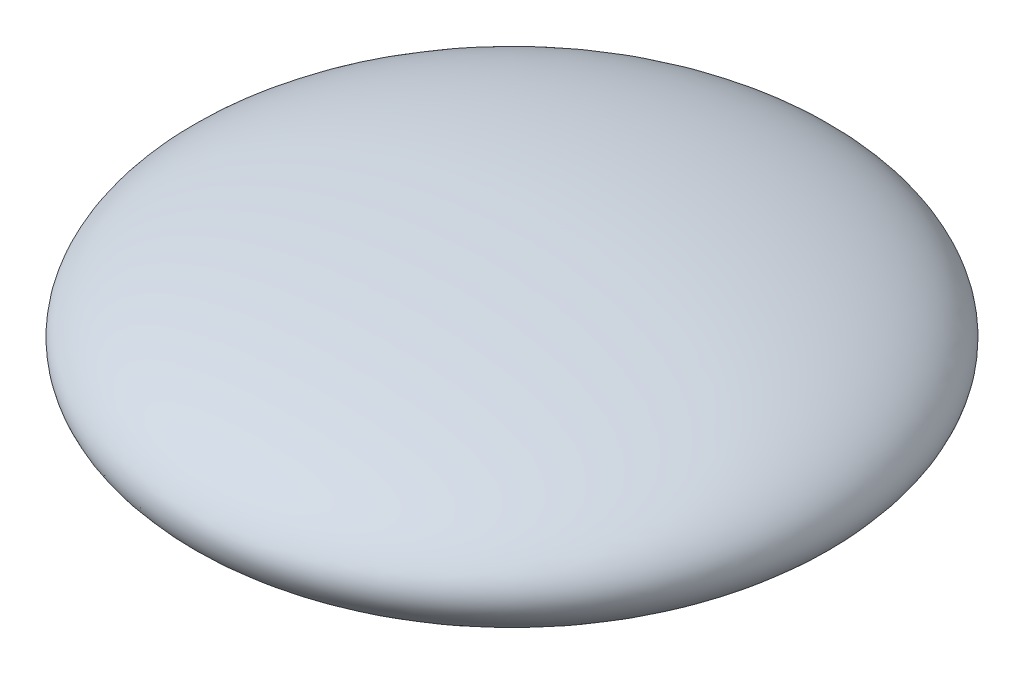
ISO-10303-21;
HEADER;
FILE_DESCRIPTION(('STEP AP214'),'2;1');
FILE_NAME('part.step','',(''),(''),'','','');
FILE_SCHEMA(('AUTOMOTIVE_DESIGN { 1 0 10303 214 1 1 1 1 }'));
ENDSEC;
DATA;
#1=APPLICATION_CONTEXT('core data for automotive mechanical design processes');
#2=APPLICATION_PROTOCOL_DEFINITION('international standard','automotive_design',2000,#1);
#3=PRODUCT_CONTEXT('',#1,'mechanical');
#4=PRODUCT('Part','Part','',(#3));
#5=PRODUCT_RELATED_PRODUCT_CATEGORY('part','',(#4));
#6=PRODUCT_DEFINITION_FORMATION('','',#4);
#7=PRODUCT_DEFINITION_CONTEXT('part definition',#1,'design');
#8=PRODUCT_DEFINITION('design','',#6,#7);
#9=PRODUCT_DEFINITION_SHAPE('','',#8);
#10=(LENGTH_UNIT() NAMED_UNIT(*) SI_UNIT(.MILLI.,.METRE.));
#11=(NAMED_UNIT(*) PLANE_ANGLE_UNIT() SI_UNIT($,.RADIAN.));
#12=(NAMED_UNIT(*) SI_UNIT($,.STERADIAN.) SOLID_ANGLE_UNIT());
#13=UNCERTAINTY_MEASURE_WITH_UNIT(LENGTH_MEASURE(1.E-05),#10,'distance_accuracy_value','');
#14=(GEOMETRIC_REPRESENTATION_CONTEXT(3) GLOBAL_UNCERTAINTY_ASSIGNED_CONTEXT((#13)) GLOBAL_UNIT_ASSIGNED_CONTEXT((#10,
#11,#12)) REPRESENTATION_CONTEXT('',''));
#15=CARTESIAN_POINT('',(0.,0.,0.));
#16=DIRECTION('',(0.,0.,1.));
#17=DIRECTION('',(1.,0.,0.));
#18=AXIS2_PLACEMENT_3D('',#15,#16,#17);
#19=CARTESIAN_POINT('',(0.,7.07229958179348,0.));
#20=DIRECTION('',(0.,0.,1.));
#21=DIRECTION('',(1.,0.,0.));
#22=AXIS2_PLACEMENT_3D('',#19,#20,#21);
#23=ELLIPSE('',#22,25.,7.22770041820652);
#24=TRIMMED_CURVE('',#23,(PARAMETER_VALUE(4.71238898038469)),
(PARAMETER_VALUE(7.85398163397448)),.T.,.PARAMETER.);
#25=CARTESIAN_POINT('',(0.,14.3,0.));
#26=DIRECTION('',(0.,1.,0.));
#27=AXIS1_PLACEMENT('',#25,#26);
#28=SURFACE_OF_REVOLUTION('',#24,#27);
#29=CARTESIAN_POINT('',(0.,14.3,0.));
#30=VERTEX_POINT('',#29);
#31=VERTEX_LOOP('',#30);
#32=FACE_BOUND('',#31,.T.);
#33=CARTESIAN_POINT('',(0.,3.5,0.));
#34=DIRECTION('',(0.,1.,0.));
#35=DIRECTION('',(-1.,0.,0.));
#36=AXIS2_PLACEMENT_3D('',#33,#34,#35);
#37=CIRCLE('',#36,21.7329783172959);
#38=CARTESIAN_POINT('',(-21.7329783172959,3.5,0.));
#39=VERTEX_POINT('',#38);
#40=EDGE_CURVE('E39',#39,#39,#37,.T.);
#41=ORIENTED_EDGE('',*,*,#40,.T.);
#42=EDGE_LOOP('',(#41));
#43=FACE_BOUND('',#42,.T.);
#44=ADVANCED_FACE('F32',(#32,#43),#28,.T.);
#45=CARTESIAN_POINT('',(0.,0.,0.));
#46=DIRECTION('',(0.,1.,0.));
#47=DIRECTION('',(-1.,0.,0.));
#48=AXIS2_PLACEMENT_3D('',#45,#46,#47);
#49=PLANE('',#48);
#50=CARTESIAN_POINT('',(0.,0.,0.));
#51=DIRECTION('',(0.,1.,0.));
#52=DIRECTION('',(-1.,0.,0.));
#53=AXIS2_PLACEMENT_3D('',#50,#51,#52);
#54=CIRCLE('',#53,14.85);
#55=CARTESIAN_POINT('',(-14.85,0.,0.));
#56=VERTEX_POINT('',#55);
#57=EDGE_CURVE('E11',#56,#56,#54,.T.);
#58=ORIENTED_EDGE('',*,*,#57,.F.);
#59=EDGE_LOOP('',(#58));
#60=FACE_BOUND('',#59,.T.);
#61=ADVANCED_FACE('F44',(#60),#49,.F.);
#62=CARTESIAN_POINT('',(0.,0.,0.));
#63=DIRECTION('',(0.,1.,0.));
#64=DIRECTION('',(-1.,0.,0.));
#65=AXIS2_PLACEMENT_3D('',#62,#63,#64);
#66=CONICAL_SURFACE('',#65,14.85,1.10037122533298);
#67=ORIENTED_EDGE('',*,*,#40,.F.);
#68=EDGE_LOOP('',(#67));
#69=FACE_BOUND('',#68,.T.);
#70=ORIENTED_EDGE('',*,*,#57,.T.);
#71=EDGE_LOOP('',(#70));
#72=FACE_BOUND('',#71,.T.);
#73=ADVANCED_FACE('F49',(#69,#72),#66,.T.);
#74=CLOSED_SHELL('',(#44,#61,#73));
#75=MANIFOLD_SOLID_BREP('B2',#74);
#76=ADVANCED_BREP_SHAPE_REPRESENTATION('',(#18,#75),#14);
#77=SHAPE_DEFINITION_REPRESENTATION(#9,#76);
ENDSEC;
END-ISO-10303-21;
